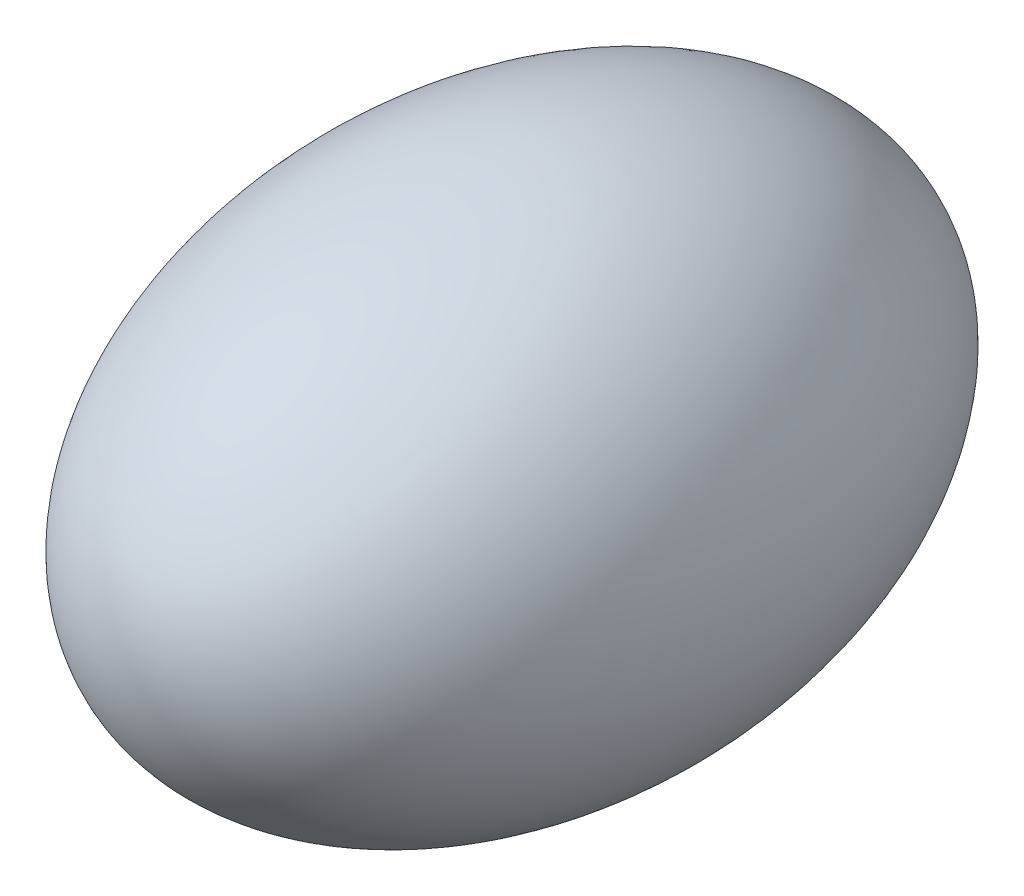
ISO-10303-21;
HEADER;
FILE_DESCRIPTION(('STEP AP214'),'2;1');
FILE_NAME('part.step','',(''),(''),'','','');
FILE_SCHEMA(('AUTOMOTIVE_DESIGN { 1 0 10303 214 1 1 1 1 }'));
ENDSEC;
DATA;
#1=APPLICATION_CONTEXT('core data for automotive mechanical design processes');
#2=APPLICATION_PROTOCOL_DEFINITION('international standard','automotive_design',2000,#1);
#3=PRODUCT_CONTEXT('',#1,'mechanical');
#4=PRODUCT('Part','Part','',(#3));
#5=PRODUCT_RELATED_PRODUCT_CATEGORY('part','',(#4));
#6=PRODUCT_DEFINITION_FORMATION('','',#4);
#7=PRODUCT_DEFINITION_CONTEXT('part definition',#1,'design');
#8=PRODUCT_DEFINITION('design','',#6,#7);
#9=PRODUCT_DEFINITION_SHAPE('','',#8);
#10=(LENGTH_UNIT() NAMED_UNIT(*) SI_UNIT(.MILLI.,.METRE.));
#11=(NAMED_UNIT(*) PLANE_ANGLE_UNIT() SI_UNIT($,.RADIAN.));
#12=(NAMED_UNIT(*) SI_UNIT($,.STERADIAN.) SOLID_ANGLE_UNIT());
#13=UNCERTAINTY_MEASURE_WITH_UNIT(LENGTH_MEASURE(1.E-05),#10,'distance_accuracy_value','');
#14=(GEOMETRIC_REPRESENTATION_CONTEXT(3) GLOBAL_UNCERTAINTY_ASSIGNED_CONTEXT((#13)) GLOBAL_UNIT_ASSIGNED_CONTEXT((#10,
#11,#12)) REPRESENTATION_CONTEXT('',''));
#15=CARTESIAN_POINT('',(0.,0.,0.));
#16=DIRECTION('',(0.,0.,1.));
#17=DIRECTION('',(1.,0.,0.));
#18=AXIS2_PLACEMENT_3D('',#15,#16,#17);
#19=CARTESIAN_POINT('',(0.,0.,0.));
#20=DIRECTION('',(0.,1.,0.));
#21=DIRECTION('',(0.,0.,-1.));
#22=AXIS2_PLACEMENT_3D('',#19,#20,#21);
#23=ELLIPSE('',#22,75.,50.);
#24=TRIMMED_CURVE('',#23,(PARAMETER_VALUE(3.14159265358979)),
(PARAMETER_VALUE(6.28318530717959)),.T.,.PARAMETER.);
#25=CARTESIAN_POINT('',(0.,0.,-75.));
#26=DIRECTION('',(0.,0.,1.));
#27=AXIS1_PLACEMENT('',#25,#26);
#28=SURFACE_OF_REVOLUTION('',#24,#27);
#29=CARTESIAN_POINT('',(0.,0.,-75.));
#30=VERTEX_POINT('',#29);
#31=VERTEX_LOOP('',#30);
#32=FACE_BOUND('',#31,.T.);
#33=CARTESIAN_POINT('',(0.,0.,75.));
#34=VERTEX_POINT('',#33);
#35=VERTEX_LOOP('',#34);
#36=FACE_BOUND('',#35,.T.);
#37=ADVANCED_FACE('F32',(#32,#36),#28,.F.);
#38=CLOSED_SHELL('',(#37));
#39=MANIFOLD_SOLID_BREP('B2',#38);
#40=ADVANCED_BREP_SHAPE_REPRESENTATION('',(#18,#39),#14);
#41=SHAPE_DEFINITION_REPRESENTATION(#9,#40);
ENDSEC;
END-ISO-10303-21;
